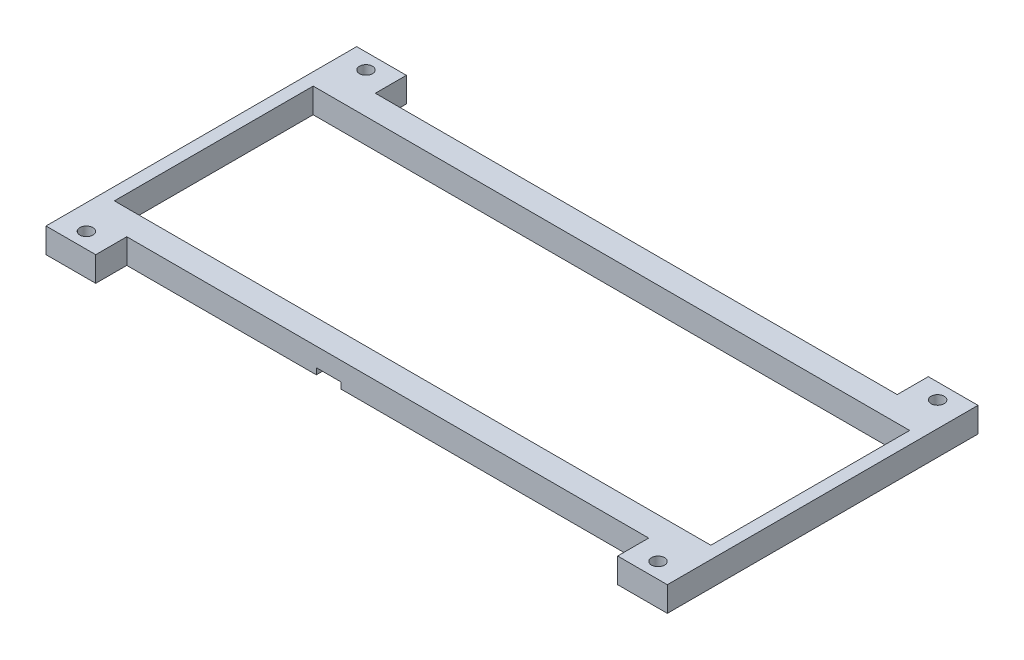
ISO-10303-21;
HEADER;
FILE_DESCRIPTION(('STEP AP214'),'2;1');
FILE_NAME('part.step','',(''),(''),'','','');
FILE_SCHEMA(('AUTOMOTIVE_DESIGN { 1 0 10303 214 1 1 1 1 }'));
ENDSEC;
DATA;
#1=APPLICATION_CONTEXT('core data for automotive mechanical design processes');
#2=APPLICATION_PROTOCOL_DEFINITION('international standard','automotive_design',2000,#1);
#3=PRODUCT_CONTEXT('',#1,'mechanical');
#4=PRODUCT('Part','Part','',(#3));
#5=PRODUCT_RELATED_PRODUCT_CATEGORY('part','',(#4));
#6=PRODUCT_DEFINITION_FORMATION('','',#4);
#7=PRODUCT_DEFINITION_CONTEXT('part definition',#1,'design');
#8=PRODUCT_DEFINITION('design','',#6,#7);
#9=PRODUCT_DEFINITION_SHAPE('','',#8);
#10=(LENGTH_UNIT() NAMED_UNIT(*) SI_UNIT(.MILLI.,.METRE.));
#11=(NAMED_UNIT(*) PLANE_ANGLE_UNIT() SI_UNIT($,.RADIAN.));
#12=(NAMED_UNIT(*) SI_UNIT($,.STERADIAN.) SOLID_ANGLE_UNIT());
#13=UNCERTAINTY_MEASURE_WITH_UNIT(LENGTH_MEASURE(1.E-05),#10,'distance_accuracy_value','');
#14=(GEOMETRIC_REPRESENTATION_CONTEXT(3) GLOBAL_UNCERTAINTY_ASSIGNED_CONTEXT((#13)) GLOBAL_UNIT_ASSIGNED_CONTEXT((#10,
#11,#12)) REPRESENTATION_CONTEXT('',''));
#15=CARTESIAN_POINT('',(0.,0.,0.));
#16=DIRECTION('',(0.,0.,1.));
#17=DIRECTION('',(1.,0.,0.));
#18=AXIS2_PLACEMENT_3D('',#15,#16,#17);
#19=CARTESIAN_POINT('',(0.,8.,0.));
#20=DIRECTION('',(0.,-1.,0.));
#21=DIRECTION('',(1.,0.,0.));
#22=AXIS2_PLACEMENT_3D('',#19,#20,#21);
#23=PLANE('',#22);
#24=CARTESIAN_POINT('',(101.289774646706,8.00000000000071,0.580654401852665));
#25=DIRECTION('',(0.,1.,0.));
#26=DIRECTION('',(-1.,0.,0.));
#27=AXIS2_PLACEMENT_3D('',#24,#25,#26);
#28=CIRCLE('',#27,2.1);
#29=CARTESIAN_POINT('',(99.1897746467055,8.00000000000069,0.580654401852665));
#30=VERTEX_POINT('',#29);
#31=EDGE_CURVE('E232',#30,#30,#28,.T.);
#32=ORIENTED_EDGE('',*,*,#31,.T.);
#33=EDGE_LOOP('',(#32));
#34=FACE_BOUND('',#33,.T.);
#35=CARTESIAN_POINT('',(-82.7102253532944,7.99999999999943,-89.4193455981473));
#36=DIRECTION('',(0.,1.,0.));
#37=DIRECTION('',(-1.,0.,0.));
#38=AXIS2_PLACEMENT_3D('',#35,#36,#37);
#39=CIRCLE('',#38,2.10000000000002);
#40=CARTESIAN_POINT('',(-84.8102253532945,7.99999999999941,-89.4193455981473));
#41=VERTEX_POINT('',#40);
#42=EDGE_CURVE('E244',#41,#41,#39,.T.);
#43=ORIENTED_EDGE('',*,*,#42,.T.);
#44=EDGE_LOOP('',(#43));
#45=FACE_BOUND('',#44,.T.);
#46=CARTESIAN_POINT('',(-82.7102253532944,7.99999999999943,0.580654401852669));
#47=DIRECTION('',(0.,1.,0.));
#48=DIRECTION('',(-1.,0.,0.));
#49=AXIS2_PLACEMENT_3D('',#46,#47,#48);
#50=CIRCLE('',#49,2.1);
#51=CARTESIAN_POINT('',(-84.8102253532945,7.99999999999941,0.580654401852669));
#52=VERTEX_POINT('',#51);
#53=EDGE_CURVE('E238',#52,#52,#50,.T.);
#54=ORIENTED_EDGE('',*,*,#53,.T.);
#55=EDGE_LOOP('',(#54));
#56=FACE_BOUND('',#55,.T.);
#57=CARTESIAN_POINT('',(101.289774646706,8.00000000000071,-89.4193455981473));
#58=DIRECTION('',(0.,1.,0.));
#59=DIRECTION('',(-1.,0.,0.));
#60=AXIS2_PLACEMENT_3D('',#57,#58,#59);
#61=CIRCLE('',#60,2.1);
#62=CARTESIAN_POINT('',(99.1897746467055,8.00000000000069,-89.4193455981473));
#63=VERTEX_POINT('',#62);
#64=EDGE_CURVE('E228',#63,#63,#61,.T.);
#65=ORIENTED_EDGE('',*,*,#64,.T.);
#66=EDGE_LOOP('',(#65));
#67=FACE_BOUND('',#66,.T.);
#68=DIRECTION('',(1.,0.,0.));
#69=VECTOR('',#68,1.);
#70=CARTESIAN_POINT('',(-86.7102253532944,7.9999999999994,-12.4193455981473));
#71=LINE('',#70,#69);
#72=CARTESIAN_POINT('',(-86.7102253532944,7.9999999999994,-12.4193455981473));
#73=VERTEX_POINT('',#72);
#74=CARTESIAN_POINT('',(-13.7102253532945,7.9999999999999,-12.4193455981473));
#75=VERTEX_POINT('',#74);
#76=EDGE_CURVE('E202',#73,#75,#71,.T.);
#77=ORIENTED_EDGE('',*,*,#76,.T.);
#78=DIRECTION('',(0.,0.,1.));
#79=VECTOR('',#78,1.);
#80=CARTESIAN_POINT('',(-13.7102253532945,7.9999999999999,-4.41934559814735));
#81=LINE('',#80,#79);
#82=CARTESIAN_POINT('',(-13.7102253532945,7.9999999999999,-4.41934559814735));
#83=VERTEX_POINT('',#82);
#84=EDGE_CURVE('E384',#75,#83,#81,.T.);
#85=ORIENTED_EDGE('',*,*,#84,.T.);
#86=DIRECTION('',(1.,0.,0.));
#87=VECTOR('',#86,1.);
#88=CARTESIAN_POINT('',(93.2897746467056,8.00000000000065,-4.41934559814733));
#89=LINE('',#88,#87);
#90=CARTESIAN_POINT('',(-74.7102253532945,7.99999999999948,-4.41934559814735));
#91=VERTEX_POINT('',#90);
#92=EDGE_CURVE('E190',#91,#83,#89,.T.);
#93=ORIENTED_EDGE('',*,*,#92,.F.);
#94=DIRECTION('',(0.,0.,-1.));
#95=VECTOR('',#94,1.);
#96=CARTESIAN_POINT('',(-74.7102253532945,7.99999999999948,-4.41934559814735));
#97=LINE('',#96,#95);
#98=CARTESIAN_POINT('',(-74.7102253532944,7.99999999999948,5.58065440185266));
#99=VERTEX_POINT('',#98);
#100=EDGE_CURVE('E294',#99,#91,#97,.T.);
#101=ORIENTED_EDGE('',*,*,#100,.F.);
#102=DIRECTION('',(1.,0.,0.));
#103=VECTOR('',#102,1.);
#104=CARTESIAN_POINT('',(-74.7102253532944,7.99999999999948,5.58065440185266));
#105=LINE('',#104,#103);
#106=CARTESIAN_POINT('',(-90.7102253532945,7.99999999999937,5.58065440185266));
#107=VERTEX_POINT('',#106);
#108=EDGE_CURVE('E292',#107,#99,#105,.T.);
#109=ORIENTED_EDGE('',*,*,#108,.F.);
#110=DIRECTION('',(0.,0.,1.));
#111=VECTOR('',#110,1.);
#112=CARTESIAN_POINT('',(-90.7102253532945,7.99999999999937,5.58065440185266));
#113=LINE('',#112,#111);
#114=CARTESIAN_POINT('',(-90.7102253532945,7.99999999999937,-94.4193455981473));
#115=VERTEX_POINT('',#114);
#116=EDGE_CURVE('E290',#115,#107,#113,.T.);
#117=ORIENTED_EDGE('',*,*,#116,.F.);
#118=DIRECTION('',(-1.,0.,0.));
#119=VECTOR('',#118,1.);
#120=CARTESIAN_POINT('',(-90.7102253532945,7.99999999999937,-94.4193455981473));
#121=LINE('',#120,#119);
#122=CARTESIAN_POINT('',(-74.7102253532944,7.99999999999948,-94.4193455981473));
#123=VERTEX_POINT('',#122);
#124=EDGE_CURVE('E288',#123,#115,#121,.T.);
#125=ORIENTED_EDGE('',*,*,#124,.F.);
#126=DIRECTION('',(0.,0.,-1.));
#127=VECTOR('',#126,1.);
#128=CARTESIAN_POINT('',(-74.7102253532944,7.99999999999948,-94.4193455981473));
#129=LINE('',#128,#127);
#130=CARTESIAN_POINT('',(-74.7102253532944,7.99999999999948,-84.4193455981473));
#131=VERTEX_POINT('',#130);
#132=EDGE_CURVE('E286',#131,#123,#129,.T.);
#133=ORIENTED_EDGE('',*,*,#132,.F.);
#134=DIRECTION('',(-1.,0.,0.));
#135=VECTOR('',#134,1.);
#136=CARTESIAN_POINT('',(-74.7102253532944,7.99999999999948,-84.4193455981473));
#137=LINE('',#136,#135);
#138=CARTESIAN_POINT('',(93.2897746467055,8.00000000000065,-84.4193455981473));
#139=VERTEX_POINT('',#138);
#140=EDGE_CURVE('E284',#139,#131,#137,.T.);
#141=ORIENTED_EDGE('',*,*,#140,.F.);
#142=DIRECTION('',(0.,0.,1.));
#143=VECTOR('',#142,1.);
#144=CARTESIAN_POINT('',(93.2897746467055,8.00000000000065,-84.4193455981473));
#145=LINE('',#144,#143);
#146=CARTESIAN_POINT('',(93.2897746467056,8.00000000000065,-94.4193455981473));
#147=VERTEX_POINT('',#146);
#148=EDGE_CURVE('E282',#147,#139,#145,.T.);
#149=ORIENTED_EDGE('',*,*,#148,.F.);
#150=DIRECTION('',(-1.,0.,0.));
#151=VECTOR('',#150,1.);
#152=CARTESIAN_POINT('',(93.2897746467056,8.00000000000065,-94.4193455981473));
#153=LINE('',#152,#151);
#154=CARTESIAN_POINT('',(109.289774646706,8.00000000000076,-94.4193455981473));
#155=VERTEX_POINT('',#154);
#156=EDGE_CURVE('E250',#155,#147,#153,.T.);
#157=ORIENTED_EDGE('',*,*,#156,.F.);
#158=DIRECTION('',(0.,0.,-1.));
#159=VECTOR('',#158,1.);
#160=CARTESIAN_POINT('',(109.289774646706,8.00000000000076,-94.4193455981473));
#161=LINE('',#160,#159);
#162=CARTESIAN_POINT('',(109.289774646706,8.00000000000076,5.58065440185266));
#163=VERTEX_POINT('',#162);
#164=EDGE_CURVE('E257',#163,#155,#161,.T.);
#165=ORIENTED_EDGE('',*,*,#164,.F.);
#166=DIRECTION('',(1.,0.,0.));
#167=VECTOR('',#166,1.);
#168=CARTESIAN_POINT('',(109.289774646706,8.00000000000076,5.58065440185266));
#169=LINE('',#168,#167);
#170=CARTESIAN_POINT('',(93.2897746467055,8.00000000000065,5.58065440185266));
#171=VERTEX_POINT('',#170);
#172=EDGE_CURVE('E300',#171,#163,#169,.T.);
#173=ORIENTED_EDGE('',*,*,#172,.F.);
#174=DIRECTION('',(0.,0.,1.));
#175=VECTOR('',#174,1.);
#176=CARTESIAN_POINT('',(93.2897746467055,8.00000000000065,5.58065440185266));
#177=LINE('',#176,#175);
#178=CARTESIAN_POINT('',(93.2897746467056,8.00000000000065,-4.41934559814733));
#179=VERTEX_POINT('',#178);
#180=EDGE_CURVE('E298',#179,#171,#177,.T.);
#181=ORIENTED_EDGE('',*,*,#180,.F.);
#182=CARTESIAN_POINT('',(-5.71022535329448,7.99999999999996,-4.41934559814734));
#183=VERTEX_POINT('',#182);
#184=EDGE_CURVE('E296',#183,#179,#89,.T.);
#185=ORIENTED_EDGE('',*,*,#184,.F.);
#186=DIRECTION('',(0.,0.,-1.));
#187=VECTOR('',#186,1.);
#188=CARTESIAN_POINT('',(-5.71022535329448,7.99999999999996,-12.4193455981473));
#189=LINE('',#188,#187);
#190=CARTESIAN_POINT('',(-5.71022535329448,7.99999999999996,-12.4193455981473));
#191=VERTEX_POINT('',#190);
#192=EDGE_CURVE('E378',#183,#191,#189,.T.);
#193=ORIENTED_EDGE('',*,*,#192,.T.);
#194=CARTESIAN_POINT('',(105.289774646706,8.00000000000073,-12.4193455981473));
#195=VERTEX_POINT('',#194);
#196=EDGE_CURVE('E217',#191,#195,#71,.T.);
#197=ORIENTED_EDGE('',*,*,#196,.T.);
#198=DIRECTION('',(0.,0.,-1.));
#199=VECTOR('',#198,1.);
#200=CARTESIAN_POINT('',(105.289774646706,8.00000000000073,-12.4193455981473));
#201=LINE('',#200,#199);
#202=CARTESIAN_POINT('',(105.289774646706,8.00000000000073,-76.4193455981473));
#203=VERTEX_POINT('',#202);
#204=EDGE_CURVE('E193',#195,#203,#201,.T.);
#205=ORIENTED_EDGE('',*,*,#204,.T.);
#206=DIRECTION('',(-1.,0.,0.));
#207=VECTOR('',#206,1.);
#208=CARTESIAN_POINT('',(105.289774646706,8.00000000000073,-76.4193455981473));
#209=LINE('',#208,#207);
#210=CARTESIAN_POINT('',(-86.7102253532944,7.9999999999994,-76.4193455981473));
#211=VERTEX_POINT('',#210);
#212=EDGE_CURVE('E211',#203,#211,#209,.T.);
#213=ORIENTED_EDGE('',*,*,#212,.T.);
#214=DIRECTION('',(0.,0.,1.));
#215=VECTOR('',#214,1.);
#216=CARTESIAN_POINT('',(-86.7102253532944,7.9999999999994,-76.4193455981473));
#217=LINE('',#216,#215);
#218=EDGE_CURVE('E214',#211,#73,#217,.T.);
#219=ORIENTED_EDGE('',*,*,#218,.T.);
#220=EDGE_LOOP('',(#77,#85,#93,#101,#109,#117,#125,#133,#141,#149,#157,#165,#173,#181,#185,#193,
#197,#205,#213,#219));
#221=FACE_BOUND('',#220,.T.);
#222=ADVANCED_FACE('F33',(#34,#45,#56,#67,#221),#23,.T.);
#223=CARTESIAN_POINT('',(93.2897746467055,16.0000000000007,-4.41934559814733));
#224=DIRECTION('',(0.,0.,-1.));
#225=DIRECTION('',(-1.,0.,0.));
#226=AXIS2_PLACEMENT_3D('',#223,#224,#225);
#227=PLANE('',#226);
#228=DIRECTION('',(0.,-1.,0.));
#229=VECTOR('',#228,1.);
#230=CARTESIAN_POINT('',(-13.7102253532945,9.9999999999999,-4.41934559814735));
#231=LINE('',#230,#229);
#232=CARTESIAN_POINT('',(-13.7102253532945,9.9999999999999,-4.41934559814735));
#233=VERTEX_POINT('',#232);
#234=EDGE_CURVE('E171',#233,#83,#231,.T.);
#235=ORIENTED_EDGE('',*,*,#234,.F.);
#236=DIRECTION('',(1.,0.,0.));
#237=VECTOR('',#236,1.);
#238=CARTESIAN_POINT('',(-5.71022535329449,9.99999999999996,-4.41934559814734));
#239=LINE('',#238,#237);
#240=CARTESIAN_POINT('',(-5.71022535329449,9.99999999999996,-4.41934559814734));
#241=VERTEX_POINT('',#240);
#242=EDGE_CURVE('E176',#233,#241,#239,.T.);
#243=ORIENTED_EDGE('',*,*,#242,.T.);
#244=DIRECTION('',(0.,-1.,0.));
#245=VECTOR('',#244,1.);
#246=CARTESIAN_POINT('',(-5.71022535329449,9.99999999999996,-4.41934559814734));
#247=LINE('',#246,#245);
#248=EDGE_CURVE('E191',#241,#183,#247,.T.);
#249=ORIENTED_EDGE('',*,*,#248,.T.);
#250=ORIENTED_EDGE('',*,*,#184,.T.);
#251=DIRECTION('',(0.,-1.,0.));
#252=VECTOR('',#251,1.);
#253=CARTESIAN_POINT('',(93.2897746467055,16.0000000000007,-4.41934559814733));
#254=LINE('',#253,#252);
#255=CARTESIAN_POINT('',(93.2897746467055,16.0000000000007,-4.41934559814733));
#256=VERTEX_POINT('',#255);
#257=EDGE_CURVE('E311',#256,#179,#254,.T.);
#258=ORIENTED_EDGE('',*,*,#257,.F.);
#259=DIRECTION('',(1.,0.,0.));
#260=VECTOR('',#259,1.);
#261=CARTESIAN_POINT('',(93.2897746467055,16.0000000000007,-4.41934559814733));
#262=LINE('',#261,#260);
#263=CARTESIAN_POINT('',(-74.7102253532946,15.9999999999995,-4.41934559814735));
#264=VERTEX_POINT('',#263);
#265=EDGE_CURVE('E271',#264,#256,#262,.T.);
#266=ORIENTED_EDGE('',*,*,#265,.F.);
#267=DIRECTION('',(0.,-1.,0.));
#268=VECTOR('',#267,1.);
#269=CARTESIAN_POINT('',(-74.7102253532946,15.9999999999995,-4.41934559814735));
#270=LINE('',#269,#268);
#271=EDGE_CURVE('E314',#264,#91,#270,.T.);
#272=ORIENTED_EDGE('',*,*,#271,.T.);
#273=ORIENTED_EDGE('',*,*,#92,.T.);
#274=EDGE_LOOP('',(#235,#243,#249,#250,#258,#266,#272,#273));
#275=FACE_BOUND('',#274,.T.);
#276=ADVANCED_FACE('F187',(#275),#227,.F.);
#277=CARTESIAN_POINT('',(-86.7102253532945,15.9999999999994,-12.4193455981473));
#278=DIRECTION('',(0.,0.,-1.));
#279=DIRECTION('',(-1.,0.,0.));
#280=AXIS2_PLACEMENT_3D('',#277,#278,#279);
#281=PLANE('',#280);
#282=DIRECTION('',(-1.,0.,0.));
#283=VECTOR('',#282,1.);
#284=CARTESIAN_POINT('',(-13.7102253532945,9.9999999999999,-12.4193455981473));
#285=LINE('',#284,#283);
#286=CARTESIAN_POINT('',(-5.71022535329449,9.99999999999996,-12.4193455981473));
#287=VERTEX_POINT('',#286);
#288=CARTESIAN_POINT('',(-13.7102253532945,9.9999999999999,-12.4193455981473));
#289=VERTEX_POINT('',#288);
#290=EDGE_CURVE('E177',#287,#289,#285,.T.);
#291=ORIENTED_EDGE('',*,*,#290,.T.);
#292=DIRECTION('',(0.,-1.,0.));
#293=VECTOR('',#292,1.);
#294=CARTESIAN_POINT('',(-13.7102253532945,9.9999999999999,-12.4193455981473));
#295=LINE('',#294,#293);
#296=EDGE_CURVE('E48',#289,#75,#295,.T.);
#297=ORIENTED_EDGE('',*,*,#296,.T.);
#298=ORIENTED_EDGE('',*,*,#76,.F.);
#299=DIRECTION('',(0.,-1.,0.));
#300=VECTOR('',#299,1.);
#301=CARTESIAN_POINT('',(-86.7102253532945,15.9999999999994,-12.4193455981473));
#302=LINE('',#301,#300);
#303=CARTESIAN_POINT('',(-86.7102253532945,15.9999999999994,-12.4193455981473));
#304=VERTEX_POINT('',#303);
#305=EDGE_CURVE('E56',#304,#73,#302,.T.);
#306=ORIENTED_EDGE('',*,*,#305,.F.);
#307=DIRECTION('',(1.,0.,0.));
#308=VECTOR('',#307,1.);
#309=CARTESIAN_POINT('',(-86.7102253532945,15.9999999999994,-12.4193455981473));
#310=LINE('',#309,#308);
#311=CARTESIAN_POINT('',(105.289774646705,16.0000000000007,-12.4193455981473));
#312=VERTEX_POINT('',#311);
#313=EDGE_CURVE('E206',#304,#312,#310,.T.);
#314=ORIENTED_EDGE('',*,*,#313,.T.);
#315=DIRECTION('',(0.,-1.,0.));
#316=VECTOR('',#315,1.);
#317=CARTESIAN_POINT('',(105.289774646705,16.0000000000007,-12.4193455981473));
#318=LINE('',#317,#316);
#319=EDGE_CURVE('E208',#312,#195,#318,.T.);
#320=ORIENTED_EDGE('',*,*,#319,.T.);
#321=ORIENTED_EDGE('',*,*,#196,.F.);
#322=DIRECTION('',(0.,-1.,0.));
#323=VECTOR('',#322,1.);
#324=CARTESIAN_POINT('',(-5.71022535329449,9.99999999999996,-12.4193455981473));
#325=LINE('',#324,#323);
#326=EDGE_CURVE('E195',#287,#191,#325,.T.);
#327=ORIENTED_EDGE('',*,*,#326,.F.);
#328=EDGE_LOOP('',(#291,#297,#298,#306,#314,#320,#321,#327));
#329=FACE_BOUND('',#328,.T.);
#330=ADVANCED_FACE('F390',(#329),#281,.T.);
#331=CARTESIAN_POINT('',(-1.11125443907003E-13,16.,0.));
#332=DIRECTION('',(0.,-1.,0.));
#333=DIRECTION('',(1.,0.,0.));
#334=AXIS2_PLACEMENT_3D('',#331,#332,#333);
#335=PLANE('',#334);
#336=CARTESIAN_POINT('',(101.289774646705,16.0000000000007,-89.4193455981473));
#337=DIRECTION('',(0.,1.,0.));
#338=DIRECTION('',(-1.,0.,0.));
#339=AXIS2_PLACEMENT_3D('',#336,#337,#338);
#340=CIRCLE('',#339,2.1);
#341=CARTESIAN_POINT('',(99.1897746467055,16.0000000000007,-89.4193455981473));
#342=VERTEX_POINT('',#341);
#343=EDGE_CURVE('E229',#342,#342,#340,.T.);
#344=ORIENTED_EDGE('',*,*,#343,.F.);
#345=EDGE_LOOP('',(#344));
#346=FACE_BOUND('',#345,.T.);
#347=CARTESIAN_POINT('',(101.289774646705,16.0000000000007,0.580654401852665));
#348=DIRECTION('',(0.,1.,0.));
#349=DIRECTION('',(-1.,0.,0.));
#350=AXIS2_PLACEMENT_3D('',#347,#348,#349);
#351=CIRCLE('',#350,2.1);
#352=CARTESIAN_POINT('',(99.1897746467055,16.0000000000007,0.580654401852665));
#353=VERTEX_POINT('',#352);
#354=EDGE_CURVE('E235',#353,#353,#351,.T.);
#355=ORIENTED_EDGE('',*,*,#354,.F.);
#356=EDGE_LOOP('',(#355));
#357=FACE_BOUND('',#356,.T.);
#358=CARTESIAN_POINT('',(-82.7102253532945,15.9999999999994,0.580654401852669));
#359=DIRECTION('',(0.,1.,0.));
#360=DIRECTION('',(-1.,0.,0.));
#361=AXIS2_PLACEMENT_3D('',#358,#359,#360);
#362=CIRCLE('',#361,2.1);
#363=CARTESIAN_POINT('',(-84.8102253532945,15.9999999999994,0.580654401852669));
#364=VERTEX_POINT('',#363);
#365=EDGE_CURVE('E241',#364,#364,#362,.T.);
#366=ORIENTED_EDGE('',*,*,#365,.F.);
#367=EDGE_LOOP('',(#366));
#368=FACE_BOUND('',#367,.T.);
#369=CARTESIAN_POINT('',(-82.7102253532945,15.9999999999994,-89.4193455981473));
#370=DIRECTION('',(0.,1.,0.));
#371=DIRECTION('',(-1.,0.,0.));
#372=AXIS2_PLACEMENT_3D('',#369,#370,#371);
#373=CIRCLE('',#372,2.10000000000002);
#374=CARTESIAN_POINT('',(-84.8102253532945,15.9999999999994,-89.4193455981473));
#375=VERTEX_POINT('',#374);
#376=EDGE_CURVE('E247',#375,#375,#373,.T.);
#377=ORIENTED_EDGE('',*,*,#376,.F.);
#378=EDGE_LOOP('',(#377));
#379=FACE_BOUND('',#378,.T.);
#380=DIRECTION('',(-1.,0.,0.));
#381=VECTOR('',#380,1.);
#382=CARTESIAN_POINT('',(93.2897746467055,16.0000000000007,-94.4193455981473));
#383=LINE('',#382,#381);
#384=CARTESIAN_POINT('',(109.289774646705,16.0000000000008,-94.4193455981473));
#385=VERTEX_POINT('',#384);
#386=CARTESIAN_POINT('',(93.2897746467055,16.0000000000007,-94.4193455981473));
#387=VERTEX_POINT('',#386);
#388=EDGE_CURVE('E253',#385,#387,#383,.T.);
#389=ORIENTED_EDGE('',*,*,#388,.T.);
#390=DIRECTION('',(0.,0.,1.));
#391=VECTOR('',#390,1.);
#392=CARTESIAN_POINT('',(93.2897746467055,16.0000000000007,-84.4193455981473));
#393=LINE('',#392,#391);
#394=CARTESIAN_POINT('',(93.2897746467055,16.0000000000007,-84.4193455981473));
#395=VERTEX_POINT('',#394);
#396=EDGE_CURVE('E256',#387,#395,#393,.T.);
#397=ORIENTED_EDGE('',*,*,#396,.T.);
#398=DIRECTION('',(-1.,0.,0.));
#399=VECTOR('',#398,1.);
#400=CARTESIAN_POINT('',(-74.7102253532945,15.9999999999995,-84.4193455981473));
#401=LINE('',#400,#399);
#402=CARTESIAN_POINT('',(-74.7102253532945,15.9999999999995,-84.4193455981473));
#403=VERTEX_POINT('',#402);
#404=EDGE_CURVE('E259',#395,#403,#401,.T.);
#405=ORIENTED_EDGE('',*,*,#404,.T.);
#406=DIRECTION('',(0.,0.,-1.));
#407=VECTOR('',#406,1.);
#408=CARTESIAN_POINT('',(-74.7102253532945,15.9999999999995,-94.4193455981473));
#409=LINE('',#408,#407);
#410=CARTESIAN_POINT('',(-74.7102253532945,15.9999999999995,-94.4193455981473));
#411=VERTEX_POINT('',#410);
#412=EDGE_CURVE('E261',#403,#411,#409,.T.);
#413=ORIENTED_EDGE('',*,*,#412,.T.);
#414=DIRECTION('',(-1.,0.,0.));
#415=VECTOR('',#414,1.);
#416=CARTESIAN_POINT('',(-90.7102253532945,15.9999999999994,-94.4193455981473));
#417=LINE('',#416,#415);
#418=CARTESIAN_POINT('',(-90.7102253532945,15.9999999999994,-94.4193455981473));
#419=VERTEX_POINT('',#418);
#420=EDGE_CURVE('E263',#411,#419,#417,.T.);
#421=ORIENTED_EDGE('',*,*,#420,.T.);
#422=DIRECTION('',(0.,0.,1.));
#423=VECTOR('',#422,1.);
#424=CARTESIAN_POINT('',(-90.7102253532945,15.9999999999994,5.58065440185266));
#425=LINE('',#424,#423);
#426=CARTESIAN_POINT('',(-90.7102253532945,15.9999999999994,5.58065440185266));
#427=VERTEX_POINT('',#426);
#428=EDGE_CURVE('E265',#419,#427,#425,.T.);
#429=ORIENTED_EDGE('',*,*,#428,.T.);
#430=DIRECTION('',(1.,0.,0.));
#431=VECTOR('',#430,1.);
#432=CARTESIAN_POINT('',(-74.7102253532945,15.9999999999995,5.58065440185266));
#433=LINE('',#432,#431);
#434=CARTESIAN_POINT('',(-74.7102253532945,15.9999999999995,5.58065440185266));
#435=VERTEX_POINT('',#434);
#436=EDGE_CURVE('E267',#427,#435,#433,.T.);
#437=ORIENTED_EDGE('',*,*,#436,.T.);
#438=DIRECTION('',(0.,0.,-1.));
#439=VECTOR('',#438,1.);
#440=CARTESIAN_POINT('',(-74.7102253532946,15.9999999999995,-4.41934559814735));
#441=LINE('',#440,#439);
#442=EDGE_CURVE('E269',#435,#264,#441,.T.);
#443=ORIENTED_EDGE('',*,*,#442,.T.);
#444=ORIENTED_EDGE('',*,*,#265,.T.);
#445=DIRECTION('',(0.,0.,1.));
#446=VECTOR('',#445,1.);
#447=CARTESIAN_POINT('',(93.2897746467055,16.0000000000007,5.58065440185266));
#448=LINE('',#447,#446);
#449=CARTESIAN_POINT('',(93.2897746467055,16.0000000000007,5.58065440185266));
#450=VERTEX_POINT('',#449);
#451=EDGE_CURVE('E273',#256,#450,#448,.T.);
#452=ORIENTED_EDGE('',*,*,#451,.T.);
#453=DIRECTION('',(1.,0.,0.));
#454=VECTOR('',#453,1.);
#455=CARTESIAN_POINT('',(109.289774646705,16.0000000000008,5.58065440185266));
#456=LINE('',#455,#454);
#457=CARTESIAN_POINT('',(109.289774646705,16.0000000000008,5.58065440185266));
#458=VERTEX_POINT('',#457);
#459=EDGE_CURVE('E275',#450,#458,#456,.T.);
#460=ORIENTED_EDGE('',*,*,#459,.T.);
#461=DIRECTION('',(0.,0.,-1.));
#462=VECTOR('',#461,1.);
#463=CARTESIAN_POINT('',(109.289774646705,16.0000000000008,-94.4193455981473));
#464=LINE('',#463,#462);
#465=EDGE_CURVE('E277',#458,#385,#464,.T.);
#466=ORIENTED_EDGE('',*,*,#465,.T.);
#467=EDGE_LOOP('',(#389,#397,#405,#413,#421,#429,#437,#443,#444,#452,#460,#466));
#468=FACE_BOUND('',#467,.T.);
#469=DIRECTION('',(0.,0.,-1.));
#470=VECTOR('',#469,1.);
#471=CARTESIAN_POINT('',(105.289774646705,16.0000000000007,-12.4193455981473));
#472=LINE('',#471,#470);
#473=CARTESIAN_POINT('',(105.289774646705,16.0000000000007,-76.4193455981473));
#474=VERTEX_POINT('',#473);
#475=EDGE_CURVE('E199',#312,#474,#472,.T.);
#476=ORIENTED_EDGE('',*,*,#475,.F.);
#477=ORIENTED_EDGE('',*,*,#313,.F.);
#478=DIRECTION('',(0.,0.,1.));
#479=VECTOR('',#478,1.);
#480=CARTESIAN_POINT('',(-86.7102253532945,15.9999999999994,-76.4193455981473));
#481=LINE('',#480,#479);
#482=CARTESIAN_POINT('',(-86.7102253532945,15.9999999999994,-76.4193455981473));
#483=VERTEX_POINT('',#482);
#484=EDGE_CURVE('E204',#483,#304,#481,.T.);
#485=ORIENTED_EDGE('',*,*,#484,.F.);
#486=DIRECTION('',(-1.,0.,0.));
#487=VECTOR('',#486,1.);
#488=CARTESIAN_POINT('',(105.289774646705,16.0000000000007,-76.4193455981473));
#489=LINE('',#488,#487);
#490=EDGE_CURVE('E201',#474,#483,#489,.T.);
#491=ORIENTED_EDGE('',*,*,#490,.F.);
#492=EDGE_LOOP('',(#476,#477,#485,#491));
#493=FACE_BOUND('',#492,.T.);
#494=ADVANCED_FACE('F353',(#346,#357,#368,#379,#468,#493),#335,.F.);
#495=CARTESIAN_POINT('',(93.2897746467055,16.0000000000007,-94.4193455981473));
#496=DIRECTION('',(0.,0.,1.));
#497=DIRECTION('',(1.,0.,0.));
#498=AXIS2_PLACEMENT_3D('',#495,#496,#497);
#499=PLANE('',#498);
#500=ORIENTED_EDGE('',*,*,#156,.T.);
#501=DIRECTION('',(0.,-1.,0.));
#502=VECTOR('',#501,1.);
#503=CARTESIAN_POINT('',(93.2897746467055,16.0000000000007,-94.4193455981473));
#504=LINE('',#503,#502);
#505=EDGE_CURVE('E11',#387,#147,#504,.T.);
#506=ORIENTED_EDGE('',*,*,#505,.F.);
#507=ORIENTED_EDGE('',*,*,#388,.F.);
#508=DIRECTION('',(0.,-1.,0.));
#509=VECTOR('',#508,1.);
#510=CARTESIAN_POINT('',(109.289774646705,16.0000000000008,-94.4193455981473));
#511=LINE('',#510,#509);
#512=EDGE_CURVE('E279',#385,#155,#511,.T.);
#513=ORIENTED_EDGE('',*,*,#512,.T.);
#514=EDGE_LOOP('',(#500,#506,#507,#513));
#515=FACE_BOUND('',#514,.T.);
#516=ADVANCED_FACE('F35',(#515),#499,.F.);
#517=CARTESIAN_POINT('',(93.2897746467055,16.0000000000007,-84.4193455981473));
#518=DIRECTION('',(1.,0.,0.));
#519=DIRECTION('',(0.,1.,0.));
#520=AXIS2_PLACEMENT_3D('',#517,#518,#519);
#521=PLANE('',#520);
#522=ORIENTED_EDGE('',*,*,#148,.T.);
#523=DIRECTION('',(0.,-1.,0.));
#524=VECTOR('',#523,1.);
#525=CARTESIAN_POINT('',(93.2897746467055,16.0000000000007,-84.4193455981473));
#526=LINE('',#525,#524);
#527=EDGE_CURVE('E41',#395,#139,#526,.T.);
#528=ORIENTED_EDGE('',*,*,#527,.F.);
#529=ORIENTED_EDGE('',*,*,#396,.F.);
#530=ORIENTED_EDGE('',*,*,#505,.T.);
#531=EDGE_LOOP('',(#522,#528,#529,#530));
#532=FACE_BOUND('',#531,.T.);
#533=ADVANCED_FACE('F358',(#532),#521,.F.);
#534=CARTESIAN_POINT('',(-74.7102253532945,15.9999999999995,-84.4193455981473));
#535=DIRECTION('',(0.,0.,1.));
#536=DIRECTION('',(1.,0.,0.));
#537=AXIS2_PLACEMENT_3D('',#534,#535,#536);
#538=PLANE('',#537);
#539=ORIENTED_EDGE('',*,*,#140,.T.);
#540=DIRECTION('',(0.,-1.,0.));
#541=VECTOR('',#540,1.);
#542=CARTESIAN_POINT('',(-74.7102253532945,15.9999999999995,-84.4193455981473));
#543=LINE('',#542,#541);
#544=EDGE_CURVE('E328',#403,#131,#543,.T.);
#545=ORIENTED_EDGE('',*,*,#544,.F.);
#546=ORIENTED_EDGE('',*,*,#404,.F.);
#547=ORIENTED_EDGE('',*,*,#527,.T.);
#548=EDGE_LOOP('',(#539,#545,#546,#547));
#549=FACE_BOUND('',#548,.T.);
#550=ADVANCED_FACE('F335',(#549),#538,.F.);
#551=CARTESIAN_POINT('',(-74.7102253532945,15.9999999999995,-94.4193455981473));
#552=DIRECTION('',(-1.,0.,0.));
#553=DIRECTION('',(0.,-1.,0.));
#554=AXIS2_PLACEMENT_3D('',#551,#552,#553);
#555=PLANE('',#554);
#556=ORIENTED_EDGE('',*,*,#132,.T.);
#557=DIRECTION('',(0.,-1.,0.));
#558=VECTOR('',#557,1.);
#559=CARTESIAN_POINT('',(-74.7102253532945,15.9999999999995,-94.4193455981473));
#560=LINE('',#559,#558);
#561=EDGE_CURVE('E325',#411,#123,#560,.T.);
#562=ORIENTED_EDGE('',*,*,#561,.F.);
#563=ORIENTED_EDGE('',*,*,#412,.F.);
#564=ORIENTED_EDGE('',*,*,#544,.T.);
#565=EDGE_LOOP('',(#556,#562,#563,#564));
#566=FACE_BOUND('',#565,.T.);
#567=ADVANCED_FACE('F345',(#566),#555,.F.);
#568=CARTESIAN_POINT('',(-90.7102253532945,15.9999999999994,-94.4193455981473));
#569=DIRECTION('',(0.,0.,1.));
#570=DIRECTION('',(1.,0.,0.));
#571=AXIS2_PLACEMENT_3D('',#568,#569,#570);
#572=PLANE('',#571);
#573=ORIENTED_EDGE('',*,*,#124,.T.);
#574=DIRECTION('',(0.,-1.,0.));
#575=VECTOR('',#574,1.);
#576=CARTESIAN_POINT('',(-90.7102253532945,15.9999999999994,-94.4193455981473));
#577=LINE('',#576,#575);
#578=EDGE_CURVE('E322',#419,#115,#577,.T.);
#579=ORIENTED_EDGE('',*,*,#578,.F.);
#580=ORIENTED_EDGE('',*,*,#420,.F.);
#581=ORIENTED_EDGE('',*,*,#561,.T.);
#582=EDGE_LOOP('',(#573,#579,#580,#581));
#583=FACE_BOUND('',#582,.T.);
#584=ADVANCED_FACE('F349',(#583),#572,.F.);
#585=CARTESIAN_POINT('',(-90.7102253532945,15.9999999999994,5.58065440185266));
#586=DIRECTION('',(1.,0.,0.));
#587=DIRECTION('',(0.,1.,0.));
#588=AXIS2_PLACEMENT_3D('',#585,#586,#587);
#589=PLANE('',#588);
#590=ORIENTED_EDGE('',*,*,#116,.T.);
#591=DIRECTION('',(0.,-1.,0.));
#592=VECTOR('',#591,1.);
#593=CARTESIAN_POINT('',(-90.7102253532945,15.9999999999994,5.58065440185266));
#594=LINE('',#593,#592);
#595=EDGE_CURVE('E319',#427,#107,#594,.T.);
#596=ORIENTED_EDGE('',*,*,#595,.F.);
#597=ORIENTED_EDGE('',*,*,#428,.F.);
#598=ORIENTED_EDGE('',*,*,#578,.T.);
#599=EDGE_LOOP('',(#590,#596,#597,#598));
#600=FACE_BOUND('',#599,.T.);
#601=ADVANCED_FACE('F440',(#600),#589,.F.);
#602=CARTESIAN_POINT('',(-74.7102253532945,15.9999999999995,5.58065440185266));
#603=DIRECTION('',(0.,0.,-1.));
#604=DIRECTION('',(-1.,0.,0.));
#605=AXIS2_PLACEMENT_3D('',#602,#603,#604);
#606=PLANE('',#605);
#607=ORIENTED_EDGE('',*,*,#108,.T.);
#608=DIRECTION('',(0.,-1.,0.));
#609=VECTOR('',#608,1.);
#610=CARTESIAN_POINT('',(-74.7102253532945,15.9999999999995,5.58065440185266));
#611=LINE('',#610,#609);
#612=EDGE_CURVE('E316',#435,#99,#611,.T.);
#613=ORIENTED_EDGE('',*,*,#612,.F.);
#614=ORIENTED_EDGE('',*,*,#436,.F.);
#615=ORIENTED_EDGE('',*,*,#595,.T.);
#616=EDGE_LOOP('',(#607,#613,#614,#615));
#617=FACE_BOUND('',#616,.T.);
#618=ADVANCED_FACE('F436',(#617),#606,.F.);
#619=CARTESIAN_POINT('',(-74.7102253532946,15.9999999999995,-4.41934559814735));
#620=DIRECTION('',(-1.,0.,0.));
#621=DIRECTION('',(0.,-1.,0.));
#622=AXIS2_PLACEMENT_3D('',#619,#620,#621);
#623=PLANE('',#622);
#624=ORIENTED_EDGE('',*,*,#100,.T.);
#625=ORIENTED_EDGE('',*,*,#271,.F.);
#626=ORIENTED_EDGE('',*,*,#442,.F.);
#627=ORIENTED_EDGE('',*,*,#612,.T.);
#628=EDGE_LOOP('',(#624,#625,#626,#627));
#629=FACE_BOUND('',#628,.T.);
#630=ADVANCED_FACE('F432',(#629),#623,.F.);
#631=CARTESIAN_POINT('',(93.2897746467055,16.0000000000007,5.58065440185266));
#632=DIRECTION('',(1.,0.,0.));
#633=DIRECTION('',(0.,1.,0.));
#634=AXIS2_PLACEMENT_3D('',#631,#632,#633);
#635=PLANE('',#634);
#636=ORIENTED_EDGE('',*,*,#180,.T.);
#637=DIRECTION('',(0.,-1.,0.));
#638=VECTOR('',#637,1.);
#639=CARTESIAN_POINT('',(93.2897746467055,16.0000000000007,5.58065440185266));
#640=LINE('',#639,#638);
#641=EDGE_CURVE('E308',#450,#171,#640,.T.);
#642=ORIENTED_EDGE('',*,*,#641,.F.);
#643=ORIENTED_EDGE('',*,*,#451,.F.);
#644=ORIENTED_EDGE('',*,*,#257,.T.);
#645=EDGE_LOOP('',(#636,#642,#643,#644));
#646=FACE_BOUND('',#645,.T.);
#647=ADVANCED_FACE('F374',(#646),#635,.F.);
#648=CARTESIAN_POINT('',(109.289774646705,16.0000000000008,5.58065440185266));
#649=DIRECTION('',(0.,0.,-1.));
#650=DIRECTION('',(-1.,0.,0.));
#651=AXIS2_PLACEMENT_3D('',#648,#649,#650);
#652=PLANE('',#651);
#653=ORIENTED_EDGE('',*,*,#172,.T.);
#654=DIRECTION('',(0.,-1.,0.));
#655=VECTOR('',#654,1.);
#656=CARTESIAN_POINT('',(109.289774646705,16.0000000000008,5.58065440185266));
#657=LINE('',#656,#655);
#658=EDGE_CURVE('E305',#458,#163,#657,.T.);
#659=ORIENTED_EDGE('',*,*,#658,.F.);
#660=ORIENTED_EDGE('',*,*,#459,.F.);
#661=ORIENTED_EDGE('',*,*,#641,.T.);
#662=EDGE_LOOP('',(#653,#659,#660,#661));
#663=FACE_BOUND('',#662,.T.);
#664=ADVANCED_FACE('F370',(#663),#652,.F.);
#665=CARTESIAN_POINT('',(109.289774646705,16.0000000000008,-94.4193455981473));
#666=DIRECTION('',(-1.,0.,0.));
#667=DIRECTION('',(0.,-1.,0.));
#668=AXIS2_PLACEMENT_3D('',#665,#666,#667);
#669=PLANE('',#668);
#670=ORIENTED_EDGE('',*,*,#164,.T.);
#671=ORIENTED_EDGE('',*,*,#512,.F.);
#672=ORIENTED_EDGE('',*,*,#465,.F.);
#673=ORIENTED_EDGE('',*,*,#658,.T.);
#674=EDGE_LOOP('',(#670,#671,#672,#673));
#675=FACE_BOUND('',#674,.T.);
#676=ADVANCED_FACE('F365',(#675),#669,.F.);
#677=CARTESIAN_POINT('',(-82.7102253532945,15.9999999999994,-89.4193455981473));
#678=DIRECTION('',(0.,-1.,0.));
#679=DIRECTION('',(1.,0.,0.));
#680=AXIS2_PLACEMENT_3D('',#677,#678,#679);
#681=CYLINDRICAL_SURFACE('',#680,2.10000000000002);
#682=ORIENTED_EDGE('',*,*,#376,.T.);
#683=EDGE_LOOP('',(#682));
#684=FACE_BOUND('',#683,.T.);
#685=ORIENTED_EDGE('',*,*,#42,.F.);
#686=EDGE_LOOP('',(#685));
#687=FACE_BOUND('',#686,.T.);
#688=ADVANCED_FACE('F428',(#684,#687),#681,.F.);
#689=CARTESIAN_POINT('',(-82.7102253532945,15.9999999999994,0.580654401852669));
#690=DIRECTION('',(0.,-1.,0.));
#691=DIRECTION('',(1.,0.,0.));
#692=AXIS2_PLACEMENT_3D('',#689,#690,#691);
#693=CYLINDRICAL_SURFACE('',#692,2.1);
#694=ORIENTED_EDGE('',*,*,#365,.T.);
#695=EDGE_LOOP('',(#694));
#696=FACE_BOUND('',#695,.T.);
#697=ORIENTED_EDGE('',*,*,#53,.F.);
#698=EDGE_LOOP('',(#697));
#699=FACE_BOUND('',#698,.T.);
#700=ADVANCED_FACE('F471',(#696,#699),#693,.F.);
#701=CARTESIAN_POINT('',(101.289774646705,16.0000000000007,0.580654401852665));
#702=DIRECTION('',(0.,-1.,0.));
#703=DIRECTION('',(1.,0.,0.));
#704=AXIS2_PLACEMENT_3D('',#701,#702,#703);
#705=CYLINDRICAL_SURFACE('',#704,2.1);
#706=ORIENTED_EDGE('',*,*,#354,.T.);
#707=EDGE_LOOP('',(#706));
#708=FACE_BOUND('',#707,.T.);
#709=ORIENTED_EDGE('',*,*,#31,.F.);
#710=EDGE_LOOP('',(#709));
#711=FACE_BOUND('',#710,.T.);
#712=ADVANCED_FACE('F480',(#708,#711),#705,.F.);
#713=CARTESIAN_POINT('',(101.289774646705,16.0000000000007,-89.4193455981473));
#714=DIRECTION('',(0.,-1.,0.));
#715=DIRECTION('',(1.,0.,0.));
#716=AXIS2_PLACEMENT_3D('',#713,#714,#715);
#717=CYLINDRICAL_SURFACE('',#716,2.1);
#718=ORIENTED_EDGE('',*,*,#343,.T.);
#719=EDGE_LOOP('',(#718));
#720=FACE_BOUND('',#719,.T.);
#721=ORIENTED_EDGE('',*,*,#64,.F.);
#722=EDGE_LOOP('',(#721));
#723=FACE_BOUND('',#722,.T.);
#724=ADVANCED_FACE('F478',(#720,#723),#717,.F.);
#725=CARTESIAN_POINT('',(105.289774646705,16.0000000000007,-12.4193455981473));
#726=DIRECTION('',(-1.,0.,0.));
#727=DIRECTION('',(0.,-1.,0.));
#728=AXIS2_PLACEMENT_3D('',#725,#726,#727);
#729=PLANE('',#728);
#730=ORIENTED_EDGE('',*,*,#204,.F.);
#731=ORIENTED_EDGE('',*,*,#319,.F.);
#732=ORIENTED_EDGE('',*,*,#475,.T.);
#733=DIRECTION('',(0.,-1.,0.));
#734=VECTOR('',#733,1.);
#735=CARTESIAN_POINT('',(105.289774646705,16.0000000000007,-76.4193455981473));
#736=LINE('',#735,#734);
#737=EDGE_CURVE('E225',#474,#203,#736,.T.);
#738=ORIENTED_EDGE('',*,*,#737,.T.);
#739=EDGE_LOOP('',(#730,#731,#732,#738));
#740=FACE_BOUND('',#739,.T.);
#741=ADVANCED_FACE('F394',(#740),#729,.T.);
#742=CARTESIAN_POINT('',(105.289774646705,16.0000000000007,-76.4193455981473));
#743=DIRECTION('',(0.,0.,1.));
#744=DIRECTION('',(1.,0.,0.));
#745=AXIS2_PLACEMENT_3D('',#742,#743,#744);
#746=PLANE('',#745);
#747=ORIENTED_EDGE('',*,*,#212,.F.);
#748=ORIENTED_EDGE('',*,*,#737,.F.);
#749=ORIENTED_EDGE('',*,*,#490,.T.);
#750=DIRECTION('',(0.,-1.,0.));
#751=VECTOR('',#750,1.);
#752=CARTESIAN_POINT('',(-86.7102253532945,15.9999999999994,-76.4193455981473));
#753=LINE('',#752,#751);
#754=EDGE_CURVE('E223',#483,#211,#753,.T.);
#755=ORIENTED_EDGE('',*,*,#754,.T.);
#756=EDGE_LOOP('',(#747,#748,#749,#755));
#757=FACE_BOUND('',#756,.T.);
#758=ADVANCED_FACE('F399',(#757),#746,.T.);
#759=CARTESIAN_POINT('',(-86.7102253532945,15.9999999999994,-76.4193455981473));
#760=DIRECTION('',(1.,0.,0.));
#761=DIRECTION('',(0.,1.,0.));
#762=AXIS2_PLACEMENT_3D('',#759,#760,#761);
#763=PLANE('',#762);
#764=ORIENTED_EDGE('',*,*,#218,.F.);
#765=ORIENTED_EDGE('',*,*,#754,.F.);
#766=ORIENTED_EDGE('',*,*,#484,.T.);
#767=ORIENTED_EDGE('',*,*,#305,.T.);
#768=EDGE_LOOP('',(#764,#765,#766,#767));
#769=FACE_BOUND('',#768,.T.);
#770=ADVANCED_FACE('F405',(#769),#763,.T.);
#771=CARTESIAN_POINT('',(-13.7102253532945,9.9999999999999,-4.41934559814735));
#772=DIRECTION('',(1.,0.,0.));
#773=DIRECTION('',(0.,1.,0.));
#774=AXIS2_PLACEMENT_3D('',#771,#772,#773);
#775=PLANE('',#774);
#776=ORIENTED_EDGE('',*,*,#84,.F.);
#777=ORIENTED_EDGE('',*,*,#296,.F.);
#778=DIRECTION('',(0.,0.,1.));
#779=VECTOR('',#778,1.);
#780=CARTESIAN_POINT('',(-13.7102253532945,9.9999999999999,-4.41934559814735));
#781=LINE('',#780,#779);
#782=EDGE_CURVE('E167',#289,#233,#781,.T.);
#783=ORIENTED_EDGE('',*,*,#782,.T.);
#784=ORIENTED_EDGE('',*,*,#234,.T.);
#785=EDGE_LOOP('',(#776,#777,#783,#784));
#786=FACE_BOUND('',#785,.T.);
#787=ADVANCED_FACE('F169',(#786),#775,.T.);
#788=CARTESIAN_POINT('',(-5.71022535329449,9.99999999999996,-12.4193455981473));
#789=DIRECTION('',(-1.,0.,0.));
#790=DIRECTION('',(0.,-1.,0.));
#791=AXIS2_PLACEMENT_3D('',#788,#789,#790);
#792=PLANE('',#791);
#793=ORIENTED_EDGE('',*,*,#192,.F.);
#794=ORIENTED_EDGE('',*,*,#248,.F.);
#795=DIRECTION('',(0.,0.,-1.));
#796=VECTOR('',#795,1.);
#797=CARTESIAN_POINT('',(-5.71022535329449,9.99999999999996,-12.4193455981473));
#798=LINE('',#797,#796);
#799=EDGE_CURVE('E182',#241,#287,#798,.T.);
#800=ORIENTED_EDGE('',*,*,#799,.T.);
#801=ORIENTED_EDGE('',*,*,#326,.T.);
#802=EDGE_LOOP('',(#793,#794,#800,#801));
#803=FACE_BOUND('',#802,.T.);
#804=ADVANCED_FACE('F382',(#803),#792,.T.);
#805=CARTESIAN_POINT('',(0.,10.,0.));
#806=DIRECTION('',(0.,-1.,0.));
#807=DIRECTION('',(1.,0.,0.));
#808=AXIS2_PLACEMENT_3D('',#805,#806,#807);
#809=PLANE('',#808);
#810=ORIENTED_EDGE('',*,*,#290,.F.);
#811=ORIENTED_EDGE('',*,*,#799,.F.);
#812=ORIENTED_EDGE('',*,*,#242,.F.);
#813=ORIENTED_EDGE('',*,*,#782,.F.);
#814=EDGE_LOOP('',(#810,#811,#812,#813));
#815=FACE_BOUND('',#814,.T.);
#816=ADVANCED_FACE('F181',(#815),#809,.T.);
#817=CLOSED_SHELL('',(#222,#276,#330,#494,#516,#533,#550,#567,#584,#601,#618,#630,#647,#664,
#676,#688,#700,#712,#724,#741,#758,#770,#787,#804,#816));
#818=MANIFOLD_SOLID_BREP('B2',#817);
#819=ADVANCED_BREP_SHAPE_REPRESENTATION('',(#18,#818),#14);
#820=SHAPE_DEFINITION_REPRESENTATION(#9,#819);
ENDSEC;
END-ISO-10303-21;
